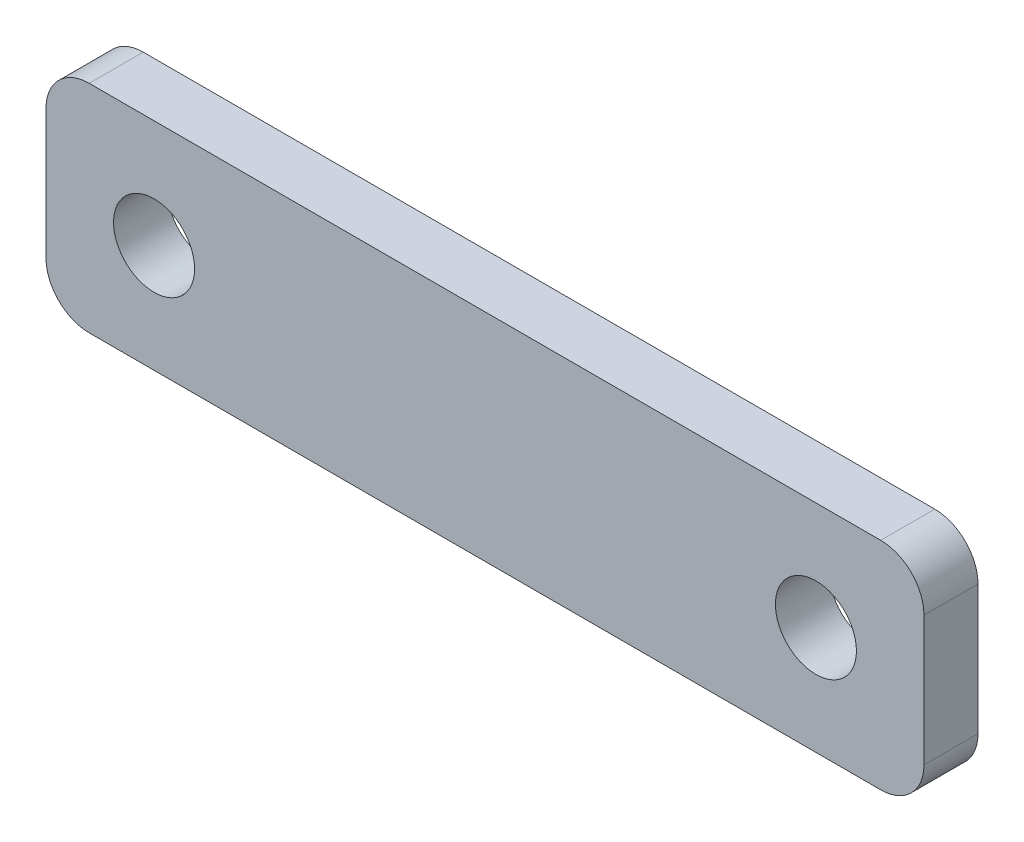
ISO-10303-21;
HEADER;
FILE_DESCRIPTION(('STEP AP214'),'2;1');
FILE_NAME('part.step','',(''),(''),'','','');
FILE_SCHEMA(('AUTOMOTIVE_DESIGN { 1 0 10303 214 1 1 1 1 }'));
ENDSEC;
DATA;
#1=APPLICATION_CONTEXT('core data for automotive mechanical design processes');
#2=APPLICATION_PROTOCOL_DEFINITION('international standard','automotive_design',2000,#1);
#3=PRODUCT_CONTEXT('',#1,'mechanical');
#4=PRODUCT('Part','Part','',(#3));
#5=PRODUCT_RELATED_PRODUCT_CATEGORY('part','',(#4));
#6=PRODUCT_DEFINITION_FORMATION('','',#4);
#7=PRODUCT_DEFINITION_CONTEXT('part definition',#1,'design');
#8=PRODUCT_DEFINITION('design','',#6,#7);
#9=PRODUCT_DEFINITION_SHAPE('','',#8);
#10=(LENGTH_UNIT() NAMED_UNIT(*) SI_UNIT(.MILLI.,.METRE.));
#11=(NAMED_UNIT(*) PLANE_ANGLE_UNIT() SI_UNIT($,.RADIAN.));
#12=(NAMED_UNIT(*) SI_UNIT($,.STERADIAN.) SOLID_ANGLE_UNIT());
#13=UNCERTAINTY_MEASURE_WITH_UNIT(LENGTH_MEASURE(1.E-05),#10,'distance_accuracy_value','');
#14=(GEOMETRIC_REPRESENTATION_CONTEXT(3) GLOBAL_UNCERTAINTY_ASSIGNED_CONTEXT((#13)) GLOBAL_UNIT_ASSIGNED_CONTEXT((#10,
#11,#12)) REPRESENTATION_CONTEXT('',''));
#15=CARTESIAN_POINT('',(0.,0.,0.));
#16=DIRECTION('',(0.,0.,1.));
#17=DIRECTION('',(1.,0.,0.));
#18=AXIS2_PLACEMENT_3D('',#15,#16,#17);
#19=CARTESIAN_POINT('',(0.,0.,-6.35));
#20=DIRECTION('',(-1.,0.,0.));
#21=DIRECTION('',(0.,0.,1.));
#22=AXIS2_PLACEMENT_3D('',#19,#20,#21);
#23=PLANE('',#22);
#24=DIRECTION('',(0.,-1.,0.));
#25=VECTOR('',#24,1.);
#26=CARTESIAN_POINT('',(0.,0.,-6.35));
#27=LINE('',#26,#25);
#28=CARTESIAN_POINT('',(0.,20.32,-6.35));
#29=VERTEX_POINT('',#28);
#30=CARTESIAN_POINT('',(0.,5.08,-6.35));
#31=VERTEX_POINT('',#30);
#32=EDGE_CURVE('E156',#29,#31,#27,.T.);
#33=ORIENTED_EDGE('',*,*,#32,.T.);
#34=DIRECTION('',(0.,0.,1.));
#35=VECTOR('',#34,1.);
#36=CARTESIAN_POINT('',(0.,5.08,-6.35));
#37=LINE('',#36,#35);
#38=CARTESIAN_POINT('',(0.,5.08,0.));
#39=VERTEX_POINT('',#38);
#40=EDGE_CURVE('E152',#31,#39,#37,.T.);
#41=ORIENTED_EDGE('',*,*,#40,.T.);
#42=DIRECTION('',(0.,-1.,0.));
#43=VECTOR('',#42,1.);
#44=CARTESIAN_POINT('',(0.,0.,0.));
#45=LINE('',#44,#43);
#46=CARTESIAN_POINT('',(0.,20.32,0.));
#47=VERTEX_POINT('',#46);
#48=EDGE_CURVE('E105',#47,#39,#45,.T.);
#49=ORIENTED_EDGE('',*,*,#48,.F.);
#50=DIRECTION('',(0.,0.,1.));
#51=VECTOR('',#50,1.);
#52=CARTESIAN_POINT('',(0.,20.32,-6.35));
#53=LINE('',#52,#51);
#54=EDGE_CURVE('E150',#47,#29,#53,.F.);
#55=ORIENTED_EDGE('',*,*,#54,.T.);
#56=EDGE_LOOP('',(#33,#41,#49,#55));
#57=FACE_BOUND('',#56,.T.);
#58=ADVANCED_FACE('F34',(#57),#23,.T.);
#59=CARTESIAN_POINT('',(0.,25.4,-6.35));
#60=DIRECTION('',(0.,1.,0.));
#61=DIRECTION('',(0.,0.,1.));
#62=AXIS2_PLACEMENT_3D('',#59,#60,#61);
#63=PLANE('',#62);
#64=DIRECTION('',(-1.,0.,0.));
#65=VECTOR('',#64,1.);
#66=CARTESIAN_POINT('',(0.,25.4,-6.35));
#67=LINE('',#66,#65);
#68=CARTESIAN_POINT('',(98.1075,25.4,-6.35));
#69=VERTEX_POINT('',#68);
#70=CARTESIAN_POINT('',(5.08,25.4,-6.35));
#71=VERTEX_POINT('',#70);
#72=EDGE_CURVE('E126',#69,#71,#67,.T.);
#73=ORIENTED_EDGE('',*,*,#72,.T.);
#74=DIRECTION('',(0.,0.,1.));
#75=VECTOR('',#74,1.);
#76=CARTESIAN_POINT('',(5.08,25.4,-6.35));
#77=LINE('',#76,#75);
#78=CARTESIAN_POINT('',(5.08,25.4,0.));
#79=VERTEX_POINT('',#78);
#80=EDGE_CURVE('E11',#71,#79,#77,.T.);
#81=ORIENTED_EDGE('',*,*,#80,.T.);
#82=DIRECTION('',(-1.,0.,0.));
#83=VECTOR('',#82,1.);
#84=CARTESIAN_POINT('',(0.,25.4,0.));
#85=LINE('',#84,#83);
#86=CARTESIAN_POINT('',(98.1075,25.4,0.));
#87=VERTEX_POINT('',#86);
#88=EDGE_CURVE('E133',#87,#79,#85,.T.);
#89=ORIENTED_EDGE('',*,*,#88,.F.);
#90=DIRECTION('',(0.,0.,1.));
#91=VECTOR('',#90,1.);
#92=CARTESIAN_POINT('',(98.1075,25.4,-6.35));
#93=LINE('',#92,#91);
#94=EDGE_CURVE('E42',#87,#69,#93,.F.);
#95=ORIENTED_EDGE('',*,*,#94,.T.);
#96=EDGE_LOOP('',(#73,#81,#89,#95));
#97=FACE_BOUND('',#96,.T.);
#98=ADVANCED_FACE('F193',(#97),#63,.T.);
#99=CARTESIAN_POINT('',(103.1875,0.,-6.35));
#100=DIRECTION('',(1.,0.,0.));
#101=DIRECTION('',(0.,0.,-1.));
#102=AXIS2_PLACEMENT_3D('',#99,#100,#101);
#103=PLANE('',#102);
#104=DIRECTION('',(0.,1.,0.));
#105=VECTOR('',#104,1.);
#106=CARTESIAN_POINT('',(103.1875,0.,0.));
#107=LINE('',#106,#105);
#108=CARTESIAN_POINT('',(103.1875,5.08,0.));
#109=VERTEX_POINT('',#108);
#110=CARTESIAN_POINT('',(103.1875,20.32,0.));
#111=VERTEX_POINT('',#110);
#112=EDGE_CURVE('E121',#109,#111,#107,.T.);
#113=ORIENTED_EDGE('',*,*,#112,.F.);
#114=DIRECTION('',(0.,0.,1.));
#115=VECTOR('',#114,1.);
#116=CARTESIAN_POINT('',(103.1875,5.08,-6.35));
#117=LINE('',#116,#115);
#118=CARTESIAN_POINT('',(103.1875,5.08,-6.35));
#119=VERTEX_POINT('',#118);
#120=EDGE_CURVE('E142',#109,#119,#117,.F.);
#121=ORIENTED_EDGE('',*,*,#120,.T.);
#122=DIRECTION('',(0.,1.,0.));
#123=VECTOR('',#122,1.);
#124=CARTESIAN_POINT('',(103.1875,0.,-6.35));
#125=LINE('',#124,#123);
#126=CARTESIAN_POINT('',(103.1875,20.32,-6.35));
#127=VERTEX_POINT('',#126);
#128=EDGE_CURVE('E130',#119,#127,#125,.T.);
#129=ORIENTED_EDGE('',*,*,#128,.T.);
#130=DIRECTION('',(0.,0.,1.));
#131=VECTOR('',#130,1.);
#132=CARTESIAN_POINT('',(103.1875,20.32,-6.35));
#133=LINE('',#132,#131);
#134=EDGE_CURVE('E139',#127,#111,#133,.T.);
#135=ORIENTED_EDGE('',*,*,#134,.T.);
#136=EDGE_LOOP('',(#113,#121,#129,#135));
#137=FACE_BOUND('',#136,.T.);
#138=ADVANCED_FACE('F172',(#137),#103,.T.);
#139=CARTESIAN_POINT('',(0.,0.,-6.35));
#140=DIRECTION('',(0.,-1.,0.));
#141=DIRECTION('',(0.,0.,-1.));
#142=AXIS2_PLACEMENT_3D('',#139,#140,#141);
#143=PLANE('',#142);
#144=DIRECTION('',(1.,0.,0.));
#145=VECTOR('',#144,1.);
#146=CARTESIAN_POINT('',(0.,0.,-6.35));
#147=LINE('',#146,#145);
#148=CARTESIAN_POINT('',(5.08,0.,-6.35));
#149=VERTEX_POINT('',#148);
#150=CARTESIAN_POINT('',(98.1075,0.,-6.35));
#151=VERTEX_POINT('',#150);
#152=EDGE_CURVE('E157',#149,#151,#147,.T.);
#153=ORIENTED_EDGE('',*,*,#152,.T.);
#154=DIRECTION('',(0.,0.,1.));
#155=VECTOR('',#154,1.);
#156=CARTESIAN_POINT('',(98.1075,0.,-6.35));
#157=LINE('',#156,#155);
#158=CARTESIAN_POINT('',(98.1075,0.,0.));
#159=VERTEX_POINT('',#158);
#160=EDGE_CURVE('E120',#151,#159,#157,.T.);
#161=ORIENTED_EDGE('',*,*,#160,.T.);
#162=DIRECTION('',(1.,0.,0.));
#163=VECTOR('',#162,1.);
#164=CARTESIAN_POINT('',(0.,0.,0.));
#165=LINE('',#164,#163);
#166=CARTESIAN_POINT('',(5.08,0.,0.));
#167=VERTEX_POINT('',#166);
#168=EDGE_CURVE('E103',#167,#159,#165,.T.);
#169=ORIENTED_EDGE('',*,*,#168,.F.);
#170=DIRECTION('',(0.,0.,1.));
#171=VECTOR('',#170,1.);
#172=CARTESIAN_POINT('',(5.08,0.,-6.35));
#173=LINE('',#172,#171);
#174=EDGE_CURVE('E117',#167,#149,#173,.F.);
#175=ORIENTED_EDGE('',*,*,#174,.T.);
#176=EDGE_LOOP('',(#153,#161,#169,#175));
#177=FACE_BOUND('',#176,.T.);
#178=ADVANCED_FACE('F116',(#177),#143,.T.);
#179=CARTESIAN_POINT('',(0.,0.,-6.35));
#180=DIRECTION('',(0.,0.,-1.));
#181=DIRECTION('',(-1.,0.,0.));
#182=AXIS2_PLACEMENT_3D('',#179,#180,#181);
#183=PLANE('',#182);
#184=CARTESIAN_POINT('',(12.7,12.7,-6.35));
#185=DIRECTION('',(0.,0.,1.));
#186=DIRECTION('',(1.,0.,0.));
#187=AXIS2_PLACEMENT_3D('',#184,#185,#186);
#188=CIRCLE('',#187,4.7625);
#189=CARTESIAN_POINT('',(17.4625,12.7,-6.35));
#190=VERTEX_POINT('',#189);
#191=EDGE_CURVE('E167',#190,#190,#188,.T.);
#192=ORIENTED_EDGE('',*,*,#191,.T.);
#193=EDGE_LOOP('',(#192));
#194=FACE_BOUND('',#193,.T.);
#195=CARTESIAN_POINT('',(90.4875,12.7,-6.35));
#196=DIRECTION('',(0.,0.,1.));
#197=DIRECTION('',(1.,0.,0.));
#198=AXIS2_PLACEMENT_3D('',#195,#196,#197);
#199=CIRCLE('',#198,4.7625);
#200=CARTESIAN_POINT('',(95.25,12.7,-6.35));
#201=VERTEX_POINT('',#200);
#202=EDGE_CURVE('E290',#201,#201,#199,.T.);
#203=ORIENTED_EDGE('',*,*,#202,.T.);
#204=EDGE_LOOP('',(#203));
#205=FACE_BOUND('',#204,.T.);
#206=ORIENTED_EDGE('',*,*,#128,.F.);
#207=CARTESIAN_POINT('',(98.1075,5.08,-6.35));
#208=DIRECTION('',(0.,0.,-1.));
#209=DIRECTION('',(-1.,0.,0.));
#210=AXIS2_PLACEMENT_3D('',#207,#208,#209);
#211=CIRCLE('',#210,5.08);
#212=EDGE_CURVE('E148',#119,#151,#211,.T.);
#213=ORIENTED_EDGE('',*,*,#212,.T.);
#214=ORIENTED_EDGE('',*,*,#152,.F.);
#215=CARTESIAN_POINT('',(5.08,5.08,-6.35));
#216=DIRECTION('',(0.,0.,-1.));
#217=DIRECTION('',(-1.,0.,0.));
#218=AXIS2_PLACEMENT_3D('',#215,#216,#217);
#219=CIRCLE('',#218,5.08);
#220=EDGE_CURVE('E125',#149,#31,#219,.T.);
#221=ORIENTED_EDGE('',*,*,#220,.T.);
#222=ORIENTED_EDGE('',*,*,#32,.F.);
#223=CARTESIAN_POINT('',(5.08,20.32,-6.35));
#224=DIRECTION('',(0.,0.,-1.));
#225=DIRECTION('',(-1.,0.,0.));
#226=AXIS2_PLACEMENT_3D('',#223,#224,#225);
#227=CIRCLE('',#226,5.08);
#228=EDGE_CURVE('E49',#29,#71,#227,.T.);
#229=ORIENTED_EDGE('',*,*,#228,.T.);
#230=ORIENTED_EDGE('',*,*,#72,.F.);
#231=CARTESIAN_POINT('',(98.1075,20.32,-6.35));
#232=DIRECTION('',(0.,0.,-1.));
#233=DIRECTION('',(-1.,0.,0.));
#234=AXIS2_PLACEMENT_3D('',#231,#232,#233);
#235=CIRCLE('',#234,5.08);
#236=EDGE_CURVE('E144',#69,#127,#235,.T.);
#237=ORIENTED_EDGE('',*,*,#236,.T.);
#238=EDGE_LOOP('',(#206,#213,#214,#221,#222,#229,#230,#237));
#239=FACE_BOUND('',#238,.T.);
#240=ADVANCED_FACE('F178',(#194,#205,#239),#183,.T.);
#241=CARTESIAN_POINT('',(0.,0.,0.));
#242=DIRECTION('',(0.,0.,-1.));
#243=DIRECTION('',(-1.,0.,0.));
#244=AXIS2_PLACEMENT_3D('',#241,#242,#243);
#245=PLANE('',#244);
#246=CARTESIAN_POINT('',(12.7,12.7,0.));
#247=DIRECTION('',(0.,0.,1.));
#248=DIRECTION('',(1.,0.,0.));
#249=AXIS2_PLACEMENT_3D('',#246,#247,#248);
#250=CIRCLE('',#249,4.7625);
#251=CARTESIAN_POINT('',(17.4625,12.7,0.));
#252=VERTEX_POINT('',#251);
#253=EDGE_CURVE('E289',#252,#252,#250,.T.);
#254=ORIENTED_EDGE('',*,*,#253,.F.);
#255=EDGE_LOOP('',(#254));
#256=FACE_BOUND('',#255,.T.);
#257=CARTESIAN_POINT('',(90.4875,12.7,0.));
#258=DIRECTION('',(0.,0.,1.));
#259=DIRECTION('',(1.,0.,0.));
#260=AXIS2_PLACEMENT_3D('',#257,#258,#259);
#261=CIRCLE('',#260,4.7625);
#262=CARTESIAN_POINT('',(95.25,12.7,0.));
#263=VERTEX_POINT('',#262);
#264=EDGE_CURVE('E162',#263,#263,#261,.T.);
#265=ORIENTED_EDGE('',*,*,#264,.F.);
#266=EDGE_LOOP('',(#265));
#267=FACE_BOUND('',#266,.T.);
#268=ORIENTED_EDGE('',*,*,#168,.T.);
#269=CARTESIAN_POINT('',(98.1075,5.08,0.));
#270=DIRECTION('',(0.,0.,-1.));
#271=DIRECTION('',(-1.,0.,0.));
#272=AXIS2_PLACEMENT_3D('',#269,#270,#271);
#273=CIRCLE('',#272,5.08);
#274=EDGE_CURVE('E110',#159,#109,#273,.F.);
#275=ORIENTED_EDGE('',*,*,#274,.T.);
#276=ORIENTED_EDGE('',*,*,#112,.T.);
#277=CARTESIAN_POINT('',(98.1075,20.32,0.));
#278=DIRECTION('',(0.,0.,-1.));
#279=DIRECTION('',(-1.,0.,0.));
#280=AXIS2_PLACEMENT_3D('',#277,#278,#279);
#281=CIRCLE('',#280,5.08);
#282=EDGE_CURVE('E128',#111,#87,#281,.F.);
#283=ORIENTED_EDGE('',*,*,#282,.T.);
#284=ORIENTED_EDGE('',*,*,#88,.T.);
#285=CARTESIAN_POINT('',(5.08,20.32,0.));
#286=DIRECTION('',(0.,0.,-1.));
#287=DIRECTION('',(-1.,0.,0.));
#288=AXIS2_PLACEMENT_3D('',#285,#286,#287);
#289=CIRCLE('',#288,5.08);
#290=EDGE_CURVE('E111',#79,#47,#289,.F.);
#291=ORIENTED_EDGE('',*,*,#290,.T.);
#292=ORIENTED_EDGE('',*,*,#48,.T.);
#293=CARTESIAN_POINT('',(5.08,5.08,0.));
#294=DIRECTION('',(0.,0.,-1.));
#295=DIRECTION('',(-1.,0.,0.));
#296=AXIS2_PLACEMENT_3D('',#293,#294,#295);
#297=CIRCLE('',#296,5.08);
#298=EDGE_CURVE('E100',#39,#167,#297,.F.);
#299=ORIENTED_EDGE('',*,*,#298,.T.);
#300=EDGE_LOOP('',(#268,#275,#276,#283,#284,#291,#292,#299));
#301=FACE_BOUND('',#300,.T.);
#302=ADVANCED_FACE('F102',(#256,#267,#301),#245,.F.);
#303=CARTESIAN_POINT('',(98.1075,5.08,-6.35));
#304=DIRECTION('',(0.,0.,1.));
#305=DIRECTION('',(1.,0.,0.));
#306=AXIS2_PLACEMENT_3D('',#303,#304,#305);
#307=CYLINDRICAL_SURFACE('',#306,5.08);
#308=ORIENTED_EDGE('',*,*,#212,.F.);
#309=ORIENTED_EDGE('',*,*,#120,.F.);
#310=ORIENTED_EDGE('',*,*,#274,.F.);
#311=ORIENTED_EDGE('',*,*,#160,.F.);
#312=EDGE_LOOP('',(#308,#309,#310,#311));
#313=FACE_BOUND('',#312,.T.);
#314=ADVANCED_FACE('F177',(#313),#307,.T.);
#315=CARTESIAN_POINT('',(5.08,5.08,-6.35));
#316=DIRECTION('',(0.,0.,1.));
#317=DIRECTION('',(1.,0.,0.));
#318=AXIS2_PLACEMENT_3D('',#315,#316,#317);
#319=CYLINDRICAL_SURFACE('',#318,5.08);
#320=ORIENTED_EDGE('',*,*,#220,.F.);
#321=ORIENTED_EDGE('',*,*,#174,.F.);
#322=ORIENTED_EDGE('',*,*,#298,.F.);
#323=ORIENTED_EDGE('',*,*,#40,.F.);
#324=EDGE_LOOP('',(#320,#321,#322,#323));
#325=FACE_BOUND('',#324,.T.);
#326=ADVANCED_FACE('F124',(#325),#319,.T.);
#327=CARTESIAN_POINT('',(5.08,20.32,-6.35));
#328=DIRECTION('',(0.,0.,1.));
#329=DIRECTION('',(1.,0.,0.));
#330=AXIS2_PLACEMENT_3D('',#327,#328,#329);
#331=CYLINDRICAL_SURFACE('',#330,5.08);
#332=ORIENTED_EDGE('',*,*,#228,.F.);
#333=ORIENTED_EDGE('',*,*,#54,.F.);
#334=ORIENTED_EDGE('',*,*,#290,.F.);
#335=ORIENTED_EDGE('',*,*,#80,.F.);
#336=EDGE_LOOP('',(#332,#333,#334,#335));
#337=FACE_BOUND('',#336,.T.);
#338=ADVANCED_FACE('F183',(#337),#331,.T.);
#339=CARTESIAN_POINT('',(98.1075,20.32,-6.35));
#340=DIRECTION('',(0.,0.,1.));
#341=DIRECTION('',(1.,0.,0.));
#342=AXIS2_PLACEMENT_3D('',#339,#340,#341);
#343=CYLINDRICAL_SURFACE('',#342,5.08);
#344=ORIENTED_EDGE('',*,*,#236,.F.);
#345=ORIENTED_EDGE('',*,*,#94,.F.);
#346=ORIENTED_EDGE('',*,*,#282,.F.);
#347=ORIENTED_EDGE('',*,*,#134,.F.);
#348=EDGE_LOOP('',(#344,#345,#346,#347));
#349=FACE_BOUND('',#348,.T.);
#350=ADVANCED_FACE('F36',(#349),#343,.T.);
#351=CARTESIAN_POINT('',(90.4875,12.7,-6.35));
#352=DIRECTION('',(0.,0.,1.));
#353=DIRECTION('',(1.,0.,0.));
#354=AXIS2_PLACEMENT_3D('',#351,#352,#353);
#355=CYLINDRICAL_SURFACE('',#354,4.7625);
#356=ORIENTED_EDGE('',*,*,#202,.F.);
#357=EDGE_LOOP('',(#356));
#358=FACE_BOUND('',#357,.T.);
#359=ORIENTED_EDGE('',*,*,#264,.T.);
#360=EDGE_LOOP('',(#359));
#361=FACE_BOUND('',#360,.T.);
#362=ADVANCED_FACE('F182',(#358,#361),#355,.F.);
#363=CARTESIAN_POINT('',(12.7,12.7,-6.35));
#364=DIRECTION('',(0.,0.,1.));
#365=DIRECTION('',(1.,0.,0.));
#366=AXIS2_PLACEMENT_3D('',#363,#364,#365);
#367=CYLINDRICAL_SURFACE('',#366,4.7625);
#368=ORIENTED_EDGE('',*,*,#191,.F.);
#369=EDGE_LOOP('',(#368));
#370=FACE_BOUND('',#369,.T.);
#371=ORIENTED_EDGE('',*,*,#253,.T.);
#372=EDGE_LOOP('',(#371));
#373=FACE_BOUND('',#372,.T.);
#374=ADVANCED_FACE('F188',(#370,#373),#367,.F.);
#375=CLOSED_SHELL('',(#58,#98,#138,#178,#240,#302,#314,#326,#338,#350,#362,#374));
#376=MANIFOLD_SOLID_BREP('B2',#375);
#377=ADVANCED_BREP_SHAPE_REPRESENTATION('',(#18,#376),#14);
#378=SHAPE_DEFINITION_REPRESENTATION(#9,#377);
ENDSEC;
END-ISO-10303-21;
